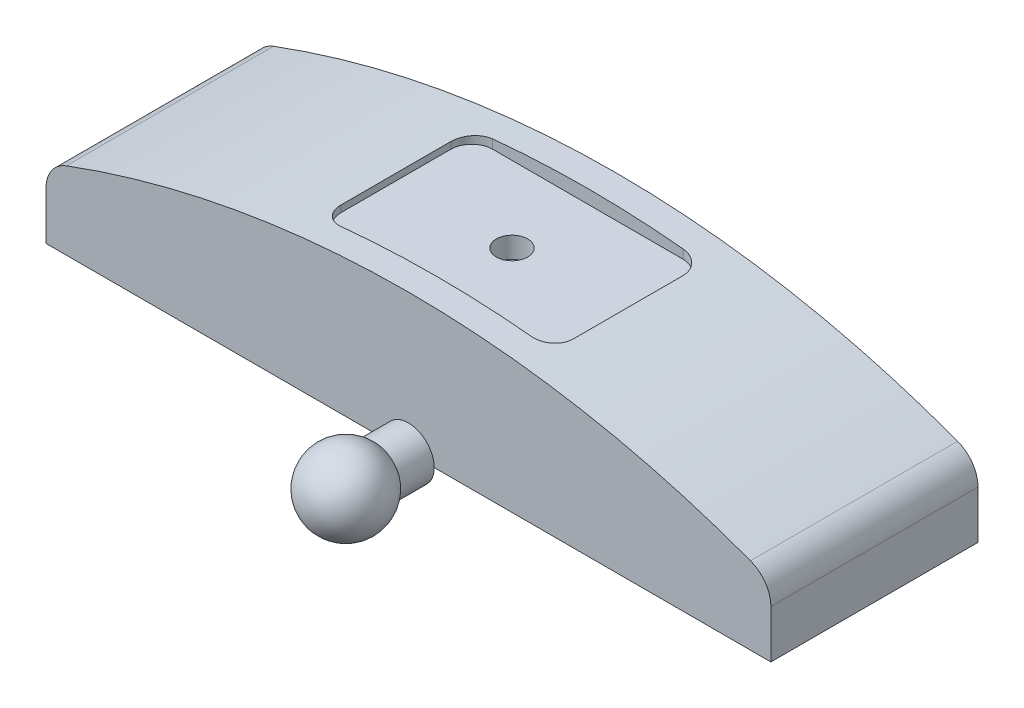
ISO-10303-21;
HEADER;
FILE_DESCRIPTION(('STEP AP214'),'2;1');
FILE_NAME('part.step','',(''),(''),'','','');
FILE_SCHEMA(('AUTOMOTIVE_DESIGN { 1 0 10303 214 1 1 1 1 }'));
ENDSEC;
DATA;
#1=APPLICATION_CONTEXT('core data for automotive mechanical design processes');
#2=APPLICATION_PROTOCOL_DEFINITION('international standard','automotive_design',2000,#1);
#3=PRODUCT_CONTEXT('',#1,'mechanical');
#4=PRODUCT('Part','Part','',(#3));
#5=PRODUCT_RELATED_PRODUCT_CATEGORY('part','',(#4));
#6=PRODUCT_DEFINITION_FORMATION('','',#4);
#7=PRODUCT_DEFINITION_CONTEXT('part definition',#1,'design');
#8=PRODUCT_DEFINITION('design','',#6,#7);
#9=PRODUCT_DEFINITION_SHAPE('','',#8);
#10=(LENGTH_UNIT() NAMED_UNIT(*) SI_UNIT(.MILLI.,.METRE.));
#11=(NAMED_UNIT(*) PLANE_ANGLE_UNIT() SI_UNIT($,.RADIAN.));
#12=(NAMED_UNIT(*) SI_UNIT($,.STERADIAN.) SOLID_ANGLE_UNIT());
#13=UNCERTAINTY_MEASURE_WITH_UNIT(LENGTH_MEASURE(1.E-05),#10,'distance_accuracy_value','');
#14=(GEOMETRIC_REPRESENTATION_CONTEXT(3) GLOBAL_UNCERTAINTY_ASSIGNED_CONTEXT((#13)) GLOBAL_UNIT_ASSIGNED_CONTEXT((#10,
#11,#12)) REPRESENTATION_CONTEXT('',''));
#15=CARTESIAN_POINT('',(0.,0.,0.));
#16=DIRECTION('',(0.,0.,1.));
#17=DIRECTION('',(1.,0.,0.));
#18=AXIS2_PLACEMENT_3D('',#15,#16,#17);
#19=CARTESIAN_POINT('',(-34.65,13.3,-9.9));
#20=DIRECTION('',(0.,0.,1.));
#21=DIRECTION('',(1.,0.,0.));
#22=AXIS2_PLACEMENT_3D('',#19,#20,#21);
#23=PLANE('',#22);
#24=CARTESIAN_POINT('',(0.,-80.2973684210529,-9.9));
#25=DIRECTION('',(0.,0.,-1.));
#26=DIRECTION('',(-1.,0.,0.));
#27=AXIS2_PLACEMENT_3D('',#24,#25,#26);
#28=CIRCLE('',#27,93.5973684210529);
#29=CARTESIAN_POINT('',(32.6980436866413,7.40271889026514,-9.9));
#30=VERTEX_POINT('',#29);
#31=CARTESIAN_POINT('',(-32.6980436866413,7.40271889026514,-9.9));
#32=VERTEX_POINT('',#31);
#33=EDGE_CURVE('E208',#30,#32,#28,.F.);
#34=ORIENTED_EDGE('',*,*,#33,.F.);
#35=CARTESIAN_POINT('',(31.65,4.59173962479709,-9.9));
#36=DIRECTION('',(0.,0.,1.));
#37=DIRECTION('',(1.,0.,0.));
#38=AXIS2_PLACEMENT_3D('',#35,#36,#37);
#39=CIRCLE('',#38,3.);
#40=CARTESIAN_POINT('',(34.65,4.59173962479709,-9.9));
#41=VERTEX_POINT('',#40);
#42=EDGE_CURVE('E301',#30,#41,#39,.F.);
#43=ORIENTED_EDGE('',*,*,#42,.T.);
#44=DIRECTION('',(0.,-1.,0.));
#45=VECTOR('',#44,1.);
#46=CARTESIAN_POINT('',(34.65,13.3,-9.9));
#47=LINE('',#46,#45);
#48=CARTESIAN_POINT('',(34.65,0.,-9.9));
#49=VERTEX_POINT('',#48);
#50=EDGE_CURVE('E256',#41,#49,#47,.T.);
#51=ORIENTED_EDGE('',*,*,#50,.T.);
#52=DIRECTION('',(-1.,0.,0.));
#53=VECTOR('',#52,1.);
#54=CARTESIAN_POINT('',(-34.65,0.,-9.9));
#55=LINE('',#54,#53);
#56=CARTESIAN_POINT('',(-34.65,0.,-9.9));
#57=VERTEX_POINT('',#56);
#58=EDGE_CURVE('E239',#49,#57,#55,.T.);
#59=ORIENTED_EDGE('',*,*,#58,.T.);
#60=DIRECTION('',(0.,-1.,0.));
#61=VECTOR('',#60,1.);
#62=CARTESIAN_POINT('',(-34.65,13.3,-9.9));
#63=LINE('',#62,#61);
#64=CARTESIAN_POINT('',(-34.65,4.59173962479709,-9.9));
#65=VERTEX_POINT('',#64);
#66=EDGE_CURVE('E254',#65,#57,#63,.T.);
#67=ORIENTED_EDGE('',*,*,#66,.F.);
#68=CARTESIAN_POINT('',(-31.65,4.59173962479709,-9.9));
#69=DIRECTION('',(0.,0.,1.));
#70=DIRECTION('',(1.,0.,0.));
#71=AXIS2_PLACEMENT_3D('',#68,#69,#70);
#72=CIRCLE('',#71,3.);
#73=EDGE_CURVE('E299',#65,#32,#72,.F.);
#74=ORIENTED_EDGE('',*,*,#73,.T.);
#75=EDGE_LOOP('',(#34,#43,#51,#59,#67,#74));
#76=FACE_BOUND('',#75,.T.);
#77=ADVANCED_FACE('F51',(#76),#23,.F.);
#78=CARTESIAN_POINT('',(-34.65,13.3,9.9));
#79=DIRECTION('',(0.,0.,-1.));
#80=DIRECTION('',(-1.,0.,0.));
#81=AXIS2_PLACEMENT_3D('',#78,#79,#80);
#82=PLANE('',#81);
#83=DIRECTION('',(0.,-1.,0.));
#84=VECTOR('',#83,1.);
#85=CARTESIAN_POINT('',(34.65,13.3,9.9));
#86=LINE('',#85,#84);
#87=CARTESIAN_POINT('',(34.65,4.59173962479709,9.9));
#88=VERTEX_POINT('',#87);
#89=CARTESIAN_POINT('',(34.65,0.,9.9));
#90=VERTEX_POINT('',#89);
#91=EDGE_CURVE('E249',#88,#90,#86,.T.);
#92=ORIENTED_EDGE('',*,*,#91,.F.);
#93=CARTESIAN_POINT('',(31.65,4.59173962479709,9.9));
#94=DIRECTION('',(0.,0.,-1.));
#95=DIRECTION('',(-1.,0.,0.));
#96=AXIS2_PLACEMENT_3D('',#93,#94,#95);
#97=CIRCLE('',#96,3.);
#98=CARTESIAN_POINT('',(32.6980436866413,7.40271889026514,9.9));
#99=VERTEX_POINT('',#98);
#100=EDGE_CURVE('E59',#88,#99,#97,.F.);
#101=ORIENTED_EDGE('',*,*,#100,.T.);
#102=CARTESIAN_POINT('',(0.,-80.2973684210529,9.9));
#103=DIRECTION('',(0.,0.,-1.));
#104=DIRECTION('',(-1.,0.,0.));
#105=AXIS2_PLACEMENT_3D('',#102,#103,#104);
#106=CIRCLE('',#105,93.5973684210529);
#107=CARTESIAN_POINT('',(-32.6980436866413,7.40271889026514,9.9));
#108=VERTEX_POINT('',#107);
#109=EDGE_CURVE('E227',#99,#108,#106,.F.);
#110=ORIENTED_EDGE('',*,*,#109,.T.);
#111=CARTESIAN_POINT('',(-31.65,4.59173962479709,9.9));
#112=DIRECTION('',(0.,0.,-1.));
#113=DIRECTION('',(-1.,0.,0.));
#114=AXIS2_PLACEMENT_3D('',#111,#112,#113);
#115=CIRCLE('',#114,3.);
#116=CARTESIAN_POINT('',(-34.65,4.59173962479709,9.9));
#117=VERTEX_POINT('',#116);
#118=EDGE_CURVE('E66',#108,#117,#115,.F.);
#119=ORIENTED_EDGE('',*,*,#118,.T.);
#120=DIRECTION('',(0.,-1.,0.));
#121=VECTOR('',#120,1.);
#122=CARTESIAN_POINT('',(-34.65,13.3,9.9));
#123=LINE('',#122,#121);
#124=CARTESIAN_POINT('',(-34.65,0.,9.9));
#125=VERTEX_POINT('',#124);
#126=EDGE_CURVE('E252',#117,#125,#123,.T.);
#127=ORIENTED_EDGE('',*,*,#126,.T.);
#128=DIRECTION('',(1.,0.,0.));
#129=VECTOR('',#128,1.);
#130=CARTESIAN_POINT('',(-34.65,0.,9.9));
#131=LINE('',#130,#129);
#132=CARTESIAN_POINT('',(-2.465,0.,9.9));
#133=VERTEX_POINT('',#132);
#134=EDGE_CURVE('E246',#125,#133,#131,.T.);
#135=ORIENTED_EDGE('',*,*,#134,.T.);
#136=CARTESIAN_POINT('',(0.,0.,9.9));
#137=DIRECTION('',(0.,0.,-1.));
#138=DIRECTION('',(-1.,0.,0.));
#139=AXIS2_PLACEMENT_3D('',#136,#137,#138);
#140=CIRCLE('',#139,2.465);
#141=CARTESIAN_POINT('',(2.465,0.,9.9));
#142=VERTEX_POINT('',#141);
#143=EDGE_CURVE('E230',#133,#142,#140,.T.);
#144=ORIENTED_EDGE('',*,*,#143,.T.);
#145=EDGE_CURVE('E245',#142,#90,#131,.T.);
#146=ORIENTED_EDGE('',*,*,#145,.T.);
#147=EDGE_LOOP('',(#92,#101,#110,#119,#127,#135,#144,#146));
#148=FACE_BOUND('',#147,.T.);
#149=ADVANCED_FACE('F306',(#148),#82,.F.);
#150=CARTESIAN_POINT('',(34.65,13.3,9.9));
#151=DIRECTION('',(-1.,0.,0.));
#152=DIRECTION('',(0.,0.,1.));
#153=AXIS2_PLACEMENT_3D('',#150,#151,#152);
#154=PLANE('',#153);
#155=ORIENTED_EDGE('',*,*,#50,.F.);
#156=DIRECTION('',(0.,0.,-1.));
#157=VECTOR('',#156,1.);
#158=CARTESIAN_POINT('',(34.65,4.59173962479709,9.9));
#159=LINE('',#158,#157);
#160=EDGE_CURVE('E74',#41,#88,#159,.F.);
#161=ORIENTED_EDGE('',*,*,#160,.T.);
#162=ORIENTED_EDGE('',*,*,#91,.T.);
#163=DIRECTION('',(0.,0.,-1.));
#164=VECTOR('',#163,1.);
#165=CARTESIAN_POINT('',(34.65,0.,9.9));
#166=LINE('',#165,#164);
#167=EDGE_CURVE('E236',#90,#49,#166,.T.);
#168=ORIENTED_EDGE('',*,*,#167,.T.);
#169=EDGE_LOOP('',(#155,#161,#162,#168));
#170=FACE_BOUND('',#169,.T.);
#171=ADVANCED_FACE('F316',(#170),#154,.F.);
#172=CARTESIAN_POINT('',(-34.65,13.3,9.9));
#173=DIRECTION('',(1.,0.,0.));
#174=DIRECTION('',(0.,0.,-1.));
#175=AXIS2_PLACEMENT_3D('',#172,#173,#174);
#176=PLANE('',#175);
#177=ORIENTED_EDGE('',*,*,#126,.F.);
#178=DIRECTION('',(0.,0.,-1.));
#179=VECTOR('',#178,1.);
#180=CARTESIAN_POINT('',(-34.65,4.59173962479709,9.9));
#181=LINE('',#180,#179);
#182=EDGE_CURVE('E12',#117,#65,#181,.T.);
#183=ORIENTED_EDGE('',*,*,#182,.T.);
#184=ORIENTED_EDGE('',*,*,#66,.T.);
#185=DIRECTION('',(0.,0.,1.));
#186=VECTOR('',#185,1.);
#187=CARTESIAN_POINT('',(-34.65,0.,9.9));
#188=LINE('',#187,#186);
#189=EDGE_CURVE('E242',#57,#125,#188,.T.);
#190=ORIENTED_EDGE('',*,*,#189,.T.);
#191=EDGE_LOOP('',(#177,#183,#184,#190));
#192=FACE_BOUND('',#191,.T.);
#193=ADVANCED_FACE('F326',(#192),#176,.F.);
#194=CARTESIAN_POINT('',(0.,0.,0.));
#195=DIRECTION('',(0.,-1.,0.));
#196=DIRECTION('',(0.,0.,-1.));
#197=AXIS2_PLACEMENT_3D('',#194,#195,#196);
#198=PLANE('',#197);
#199=ORIENTED_EDGE('',*,*,#167,.F.);
#200=ORIENTED_EDGE('',*,*,#145,.F.);
#201=EDGE_CURVE('E250',#133,#142,#131,.T.);
#202=ORIENTED_EDGE('',*,*,#201,.F.);
#203=ORIENTED_EDGE('',*,*,#134,.F.);
#204=ORIENTED_EDGE('',*,*,#189,.F.);
#205=ORIENTED_EDGE('',*,*,#58,.F.);
#206=EDGE_LOOP('',(#199,#200,#202,#203,#204,#205));
#207=FACE_BOUND('',#206,.T.);
#208=ADVANCED_FACE('F320',(#207),#198,.T.);
#209=CARTESIAN_POINT('',(2.465,0.,9.9));
#210=DIRECTION('',(0.,0.,1.));
#211=DIRECTION('',(1.,0.,0.));
#212=AXIS2_PLACEMENT_3D('',#209,#210,#211);
#213=PLANE('',#212);
#214=EDGE_CURVE('E229',#142,#133,#140,.T.);
#215=ORIENTED_EDGE('',*,*,#214,.T.);
#216=ORIENTED_EDGE('',*,*,#201,.T.);
#217=EDGE_LOOP('',(#215,#216));
#218=FACE_BOUND('',#217,.T.);
#219=ADVANCED_FACE('F349',(#218),#213,.F.);
#220=CARTESIAN_POINT('',(0.,0.,15.8927017510003));
#221=DIRECTION('',(0.,0.,-1.));
#222=DIRECTION('',(1.,0.,0.));
#223=AXIS2_PLACEMENT_3D('',#220,#221,#222);
#224=SPHERICAL_SURFACE('',#223,3.71);
#225=CARTESIAN_POINT('',(0.,0.,13.12));
#226=DIRECTION('',(0.,0.,-1.));
#227=DIRECTION('',(-1.,0.,0.));
#228=AXIS2_PLACEMENT_3D('',#225,#226,#227);
#229=CIRCLE('',#228,2.465);
#230=CARTESIAN_POINT('',(-2.465,0.,13.12));
#231=VERTEX_POINT('',#230);
#232=EDGE_CURVE('E233',#231,#231,#229,.T.);
#233=ORIENTED_EDGE('',*,*,#232,.F.);
#234=EDGE_LOOP('',(#233));
#235=FACE_BOUND('',#234,.T.);
#236=ADVANCED_FACE('F354',(#235),#224,.T.);
#237=CARTESIAN_POINT('',(0.,0.,0.));
#238=DIRECTION('',(0.,0.,-1.));
#239=DIRECTION('',(-1.,0.,0.));
#240=AXIS2_PLACEMENT_3D('',#237,#238,#239);
#241=CYLINDRICAL_SURFACE('',#240,2.465);
#242=ORIENTED_EDGE('',*,*,#143,.F.);
#243=ORIENTED_EDGE('',*,*,#214,.F.);
#244=EDGE_LOOP('',(#242,#243));
#245=FACE_BOUND('',#244,.T.);
#246=ORIENTED_EDGE('',*,*,#232,.T.);
#247=EDGE_LOOP('',(#246));
#248=FACE_BOUND('',#247,.T.);
#249=ADVANCED_FACE('F359',(#245,#248),#241,.T.);
#250=CARTESIAN_POINT('',(0.,-80.2973684210529,19.6027017510003));
#251=DIRECTION('',(0.,0.,-1.));
#252=DIRECTION('',(-1.,0.,0.));
#253=AXIS2_PLACEMENT_3D('',#250,#251,#252);
#254=CYLINDRICAL_SURFACE('',#253,93.5973684210529);
#255=CARTESIAN_POINT('',(0.,-80.2973684210529,-7.25));
#256=DIRECTION('',(0.,0.,-1.));
#257=DIRECTION('',(-1.,0.,0.));
#258=AXIS2_PLACEMENT_3D('',#255,#256,#257);
#259=CIRCLE('',#258,93.5973684210529);
#260=CARTESIAN_POINT('',(-9.09999999999998,12.8565760759265,-7.25));
#261=VERTEX_POINT('',#260);
#262=CARTESIAN_POINT('',(9.09999999999999,12.8565760759265,-7.25));
#263=VERTEX_POINT('',#262);
#264=EDGE_CURVE('E258',#261,#263,#259,.T.);
#265=ORIENTED_EDGE('',*,*,#264,.T.);
#266=CARTESIAN_POINT('',(9.09999999999999,12.8565760759265,-7.25));
#267=CARTESIAN_POINT('',(9.15653455023131,12.8510536330628,-7.24999948761094));
#268=CARTESIAN_POINT('',(9.21303678800726,12.8454817425652,-7.24760140821842));
#269=CARTESIAN_POINT('',(9.32562715926016,12.8342762889866,-7.23803614812002));
#270=CARTESIAN_POINT('',(9.38171531248921,12.8286427288797,-7.23086919639805));
#271=CARTESIAN_POINT('',(9.54866974666014,12.8117220901304,-7.20228333344782));
#272=CARTESIAN_POINT('',(9.65840359692658,12.8003976855252,-7.17377922915236));
#273=CARTESIAN_POINT('',(9.87151656218214,12.7780421654695,-7.09866194207774));
#274=CARTESIAN_POINT('',(9.97489259188444,12.767011193865,-7.05204004627139));
#275=CARTESIAN_POINT('',(10.1723475524341,12.7456355252988,-6.94199141093495));
#276=CARTESIAN_POINT('',(10.2664282640409,12.7352906970139,-6.87856789879459));
#277=CARTESIAN_POINT('',(10.4424864865457,12.7156935920161,-6.73677265819884));
#278=CARTESIAN_POINT('',(10.5244790060956,12.7064399633821,-6.65841974803957));
#279=CARTESIAN_POINT('',(10.6741460419677,12.68938155021,-6.48888979566538));
#280=CARTESIAN_POINT('',(10.7418179913001,12.6815770254572,-6.39771045915694));
#281=CARTESIAN_POINT('',(10.8605323513303,12.667785154184,-6.20562318201792));
#282=CARTESIAN_POINT('',(10.9116562286376,12.6617889157175,-6.10476617103821));
#283=CARTESIAN_POINT('',(10.9962032567277,12.6518258414829,-5.89582639910637));
#284=CARTESIAN_POINT('',(11.0296384602603,12.6478576239202,-5.78774861496166));
#285=CARTESIAN_POINT('',(11.0691134116934,12.6431627821403,-5.60745214697946));
#286=CARTESIAN_POINT('',(11.0806887140456,12.6417827258387,-5.53641385023785));
#287=CARTESIAN_POINT('',(11.0961307551488,12.6399398883787,-5.39359417755277));
#288=CARTESIAN_POINT('',(11.1000083362938,12.6394758170425,-5.32181399013144));
#289=CARTESIAN_POINT('',(11.1,12.6394777452891,-5.24999999999999));
#290=B_SPLINE_CURVE_WITH_KNOTS('',3,(#266,#267,#268,#269,#270,#271,#272,#273,#274,#275,#276,
#277,#278,#279,#280,#281,#282,#283,#284,#285,#286,#287,#288,#289),.UNSPECIFIED.,.F.,.F.,(4,2,2,
2,2,2,2,2,2,2,2,4),(0.,0.170306027196622,0.340603877506613,0.680671059291494,1.02090198557498,
1.36106760489211,1.70080725325535,2.04060774911641,2.37870901426496,2.71657960550479,
2.93215350793614,3.14742355417456),.UNSPECIFIED.);
#291=CARTESIAN_POINT('',(11.1,12.639477745289,-5.24999999999999));
#292=VERTEX_POINT('',#291);
#293=EDGE_CURVE('E168',#263,#292,#290,.T.);
#294=ORIENTED_EDGE('',*,*,#293,.T.);
#295=DIRECTION('',(0.,0.,-1.));
#296=VECTOR('',#295,1.);
#297=CARTESIAN_POINT('',(11.1,12.639477745289,19.6027017510003));
#298=LINE('',#297,#296);
#299=CARTESIAN_POINT('',(11.1,12.639477745289,5.24999999999999));
#300=VERTEX_POINT('',#299);
#301=EDGE_CURVE('E293',#292,#300,#298,.F.);
#302=ORIENTED_EDGE('',*,*,#301,.T.);
#303=CARTESIAN_POINT('',(11.1,12.639477745289,5.24999999999999));
#304=CARTESIAN_POINT('',(11.0999998426773,12.6394774709147,5.30599628355265));
#305=CARTESIAN_POINT('',(11.0976468211732,12.6397588321076,5.36196562292542));
#306=CARTESIAN_POINT('',(11.0882611027799,12.6408792170863,5.47350124783135));
#307=CARTESIAN_POINT('',(11.0812287069477,12.6417182049961,5.52906755906165));
#308=CARTESIAN_POINT('',(11.0531860193531,12.6450590888856,5.69444303246902));
#309=CARTESIAN_POINT('',(11.025230001089,12.6483849495873,5.80314036321473));
#310=CARTESIAN_POINT('',(10.9516028018369,12.6570888626359,6.01425631018584));
#311=CARTESIAN_POINT('',(10.9059245308835,12.6624677362973,6.11667239452128));
#312=CARTESIAN_POINT('',(10.7981877767267,12.675043863277,6.3123680242856));
#313=CARTESIAN_POINT('',(10.7361311041927,12.6822409155878,6.40564857810617));
#314=CARTESIAN_POINT('',(10.5971840484717,12.698179631509,6.58078185966248));
#315=CARTESIAN_POINT('',(10.5202437107798,12.7069264882234,6.66259445584513));
#316=CARTESIAN_POINT('',(10.3538415110802,12.7255982942276,6.81217750617866));
#317=CARTESIAN_POINT('',(10.2643769750164,12.7355234950381,6.87994495384881));
#318=CARTESIAN_POINT('',(10.0748460994836,12.7562397276893,6.99995522765812));
#319=CARTESIAN_POINT('',(9.97471397147699,12.7670360193401,7.05209313809807));
#320=CARTESIAN_POINT('',(9.76717544662082,12.7890458411585,7.13878440485414));
#321=CARTESIAN_POINT('',(9.65977290494422,12.8002591488018,7.17334699907894));
#322=CARTESIAN_POINT('',(9.47648214225205,12.8190596538466,7.21570890834985));
#323=CARTESIAN_POINT('',(9.40172048878523,12.8266386044575,7.22855832640662));
#324=CARTESIAN_POINT('',(9.25131923726787,12.8417009003222,7.2457032395715));
#325=CARTESIAN_POINT('',(9.17568099477044,12.8491843631893,7.25001052729763));
#326=CARTESIAN_POINT('',(9.09999999999999,12.8565760759264,7.25));
#327=B_SPLINE_CURVE_WITH_KNOTS('',3,(#303,#304,#305,#306,#307,#308,#309,#310,#311,#312,#313,
#314,#315,#316,#317,#318,#319,#320,#321,#322,#323,#324,#325,#326),.UNSPECIFIED.,.F.,.F.,(4,2,2,
2,2,2,2,2,2,2,2,4),(0.,0.167885269410749,0.335759738628335,0.670881901590965,1.00613827201593,
1.34135759460158,1.6777221820723,2.01415869698149,2.35280547191413,2.6912740634207,
2.91952573291608,3.14746207548646),.UNSPECIFIED.);
#328=CARTESIAN_POINT('',(9.09999999999999,12.8565760759265,7.25));
#329=VERTEX_POINT('',#328);
#330=EDGE_CURVE('E390',#300,#329,#327,.T.);
#331=ORIENTED_EDGE('',*,*,#330,.T.);
#332=CARTESIAN_POINT('',(0.,-80.2973684210529,7.25));
#333=DIRECTION('',(0.,0.,1.));
#334=DIRECTION('',(1.,0.,0.));
#335=AXIS2_PLACEMENT_3D('',#332,#333,#334);
#336=CIRCLE('',#335,93.5973684210529);
#337=CARTESIAN_POINT('',(-9.09999999999998,12.8565760759265,7.25));
#338=VERTEX_POINT('',#337);
#339=EDGE_CURVE('E391',#329,#338,#336,.T.);
#340=ORIENTED_EDGE('',*,*,#339,.T.);
#341=CARTESIAN_POINT('',(-9.09999999999998,12.8565760759265,7.25));
#342=CARTESIAN_POINT('',(-9.15653455023131,12.8510536330628,7.24999948761094));
#343=CARTESIAN_POINT('',(-9.21303678800726,12.8454817425652,7.24760140821843));
#344=CARTESIAN_POINT('',(-9.32562715926016,12.8342762889866,7.23803614812002));
#345=CARTESIAN_POINT('',(-9.38171531248921,12.8286427288797,7.23086919639805));
#346=CARTESIAN_POINT('',(-9.54866974666014,12.8117220901304,7.20228333344782));
#347=CARTESIAN_POINT('',(-9.65840359692657,12.8003976855252,7.17377922915236));
#348=CARTESIAN_POINT('',(-9.87151656218214,12.7780421654695,7.09866194207774));
#349=CARTESIAN_POINT('',(-9.97489259188443,12.767011193865,7.0520400462714));
#350=CARTESIAN_POINT('',(-10.1723475524341,12.7456355252988,6.94199141093496));
#351=CARTESIAN_POINT('',(-10.2664282640409,12.7352906970139,6.87856789879459));
#352=CARTESIAN_POINT('',(-10.4424864865456,12.7156935920161,6.73677265819884));
#353=CARTESIAN_POINT('',(-10.5244790060956,12.7064399633821,6.65841974803957));
#354=CARTESIAN_POINT('',(-10.6741460419677,12.68938155021,6.48888979566538));
#355=CARTESIAN_POINT('',(-10.7418179913001,12.6815770254572,6.39771045915694));
#356=CARTESIAN_POINT('',(-10.8605323513303,12.667785154184,6.20562318201792));
#357=CARTESIAN_POINT('',(-10.9116562286375,12.6617889157175,6.10476617103821));
#358=CARTESIAN_POINT('',(-10.9962032567277,12.6518258414829,5.89582639910637));
#359=CARTESIAN_POINT('',(-11.0296384602602,12.6478576239202,5.78774861496166));
#360=CARTESIAN_POINT('',(-11.0691134116934,12.6431627821403,5.60745214697947));
#361=CARTESIAN_POINT('',(-11.0806887140455,12.6417827258387,5.53641385023786));
#362=CARTESIAN_POINT('',(-11.0961307551488,12.6399398883787,5.39359417755278));
#363=CARTESIAN_POINT('',(-11.1000083362938,12.6394758170425,5.32181399013144));
#364=CARTESIAN_POINT('',(-11.1,12.6394777452891,5.24999999999999));
#365=B_SPLINE_CURVE_WITH_KNOTS('',3,(#341,#342,#343,#344,#345,#346,#347,#348,#349,#350,#351,
#352,#353,#354,#355,#356,#357,#358,#359,#360,#361,#362,#363,#364),.UNSPECIFIED.,.F.,.F.,(4,2,2,
2,2,2,2,2,2,2,2,4),(0.,0.170306027196622,0.340603877506617,0.680671059291495,1.02090198557498,
1.36106760489211,1.70080725325535,2.04060774911641,2.37870901426496,2.71657960550479,
2.93215350793614,3.14742355417456),.UNSPECIFIED.);
#366=CARTESIAN_POINT('',(-11.1,12.639477745289,5.24999999999999));
#367=VERTEX_POINT('',#366);
#368=EDGE_CURVE('E382',#338,#367,#365,.T.);
#369=ORIENTED_EDGE('',*,*,#368,.T.);
#370=DIRECTION('',(0.,0.,-1.));
#371=VECTOR('',#370,1.);
#372=CARTESIAN_POINT('',(-11.1,12.639477745289,19.6027017510003));
#373=LINE('',#372,#371);
#374=CARTESIAN_POINT('',(-11.1,12.639477745289,-5.24999999999998));
#375=VERTEX_POINT('',#374);
#376=EDGE_CURVE('E268',#367,#375,#373,.T.);
#377=ORIENTED_EDGE('',*,*,#376,.T.);
#378=CARTESIAN_POINT('',(-11.1,12.639477745289,-5.24999999999999));
#379=CARTESIAN_POINT('',(-11.0999998426773,12.6394774709147,-5.30599628355264));
#380=CARTESIAN_POINT('',(-11.0976468211732,12.6397588321076,-5.36196562292542));
#381=CARTESIAN_POINT('',(-11.0882611027799,12.6408792170863,-5.47350124783134));
#382=CARTESIAN_POINT('',(-11.0812287069477,12.6417182049961,-5.52906755906164));
#383=CARTESIAN_POINT('',(-11.0531860193531,12.6450590888856,-5.69444303246902));
#384=CARTESIAN_POINT('',(-11.025230001089,12.6483849495873,-5.80314036321473));
#385=CARTESIAN_POINT('',(-10.9516028018369,12.6570888626359,-6.01425631018584));
#386=CARTESIAN_POINT('',(-10.9059245308835,12.6624677362974,-6.11667239452127));
#387=CARTESIAN_POINT('',(-10.7981877767267,12.6750438632771,-6.3123680242856));
#388=CARTESIAN_POINT('',(-10.7361311041927,12.6822409155878,-6.40564857810617));
#389=CARTESIAN_POINT('',(-10.5971840484717,12.698179631509,-6.58078185966247));
#390=CARTESIAN_POINT('',(-10.5202437107798,12.7069264882234,-6.66259445584512));
#391=CARTESIAN_POINT('',(-10.3538415110802,12.7255982942276,-6.81217750617865));
#392=CARTESIAN_POINT('',(-10.2643769750164,12.7355234950381,-6.87994495384881));
#393=CARTESIAN_POINT('',(-10.0748460994836,12.7562397276893,-6.99995522765811));
#394=CARTESIAN_POINT('',(-9.97471397147699,12.7670360193401,-7.05209313809807));
#395=CARTESIAN_POINT('',(-9.76717544662081,12.7890458411586,-7.13878440485414));
#396=CARTESIAN_POINT('',(-9.65977290494422,12.8002591488018,-7.17334699907894));
#397=CARTESIAN_POINT('',(-9.47648214225204,12.8190596538466,-7.21570890834984));
#398=CARTESIAN_POINT('',(-9.40172048878522,12.8266386044575,-7.22855832640662));
#399=CARTESIAN_POINT('',(-9.25131923726786,12.8417009003222,-7.2457032395715));
#400=CARTESIAN_POINT('',(-9.17568099477043,12.8491843631893,-7.25001052729763));
#401=CARTESIAN_POINT('',(-9.09999999999998,12.8565760759264,-7.25));
#402=B_SPLINE_CURVE_WITH_KNOTS('',3,(#378,#379,#380,#381,#382,#383,#384,#385,#386,#387,#388,
#389,#390,#391,#392,#393,#394,#395,#396,#397,#398,#399,#400,#401),.UNSPECIFIED.,.F.,.F.,(4,2,2,
2,2,2,2,2,2,2,2,4),(0.,0.16788526941075,0.335759738628336,0.670881901590966,1.00613827201593,
1.34135759460158,1.6777221820723,2.01415869698149,2.35280547191413,2.6912740634207,
2.91952573291608,3.14746207548646),.UNSPECIFIED.);
#403=EDGE_CURVE('E260',#375,#261,#402,.T.);
#404=ORIENTED_EDGE('',*,*,#403,.T.);
#405=EDGE_LOOP('',(#265,#294,#302,#331,#340,#369,#377,#404));
#406=FACE_BOUND('',#405,.T.);
#407=ORIENTED_EDGE('',*,*,#109,.F.);
#408=DIRECTION('',(0.,0.,-1.));
#409=VECTOR('',#408,1.);
#410=CARTESIAN_POINT('',(32.6980436866413,7.40271889026514,19.6027017510003));
#411=LINE('',#410,#409);
#412=EDGE_CURVE('E296',#99,#30,#411,.T.);
#413=ORIENTED_EDGE('',*,*,#412,.T.);
#414=ORIENTED_EDGE('',*,*,#33,.T.);
#415=DIRECTION('',(0.,0.,-1.));
#416=VECTOR('',#415,1.);
#417=CARTESIAN_POINT('',(-32.6980436866413,7.40271889026514,19.6027017510003));
#418=LINE('',#417,#416);
#419=EDGE_CURVE('E292',#32,#108,#418,.F.);
#420=ORIENTED_EDGE('',*,*,#419,.T.);
#421=EDGE_LOOP('',(#407,#413,#414,#420));
#422=FACE_BOUND('',#421,.T.);
#423=ADVANCED_FACE('F270',(#406,#422),#254,.T.);
#424=CARTESIAN_POINT('',(9.1,12.,-5.25));
#425=DIRECTION('',(0.,1.,0.));
#426=DIRECTION('',(0.,0.,1.));
#427=AXIS2_PLACEMENT_3D('',#424,#425,#426);
#428=CYLINDRICAL_SURFACE('',#427,2.);
#429=DIRECTION('',(0.,1.,0.));
#430=VECTOR('',#429,1.);
#431=CARTESIAN_POINT('',(9.09999999999999,12.,-7.25));
#432=LINE('',#431,#430);
#433=CARTESIAN_POINT('',(9.09999999999999,12.,-7.25));
#434=VERTEX_POINT('',#433);
#435=EDGE_CURVE('E160',#434,#263,#432,.T.);
#436=ORIENTED_EDGE('',*,*,#435,.F.);
#437=CARTESIAN_POINT('',(9.1,12.,-5.25));
#438=DIRECTION('',(0.,1.,0.));
#439=DIRECTION('',(0.,0.,-1.));
#440=AXIS2_PLACEMENT_3D('',#437,#438,#439);
#441=CIRCLE('',#440,2.);
#442=CARTESIAN_POINT('',(11.1,12.,-5.24999999999999));
#443=VERTEX_POINT('',#442);
#444=EDGE_CURVE('E165',#443,#434,#441,.T.);
#445=ORIENTED_EDGE('',*,*,#444,.F.);
#446=DIRECTION('',(0.,1.,0.));
#447=VECTOR('',#446,1.);
#448=CARTESIAN_POINT('',(11.1,12.,-5.24999999999999));
#449=LINE('',#448,#447);
#450=EDGE_CURVE('E206',#443,#292,#449,.T.);
#451=ORIENTED_EDGE('',*,*,#450,.T.);
#452=ORIENTED_EDGE('',*,*,#293,.F.);
#453=EDGE_LOOP('',(#436,#445,#451,#452));
#454=FACE_BOUND('',#453,.T.);
#455=ADVANCED_FACE('F162',(#454),#428,.F.);
#456=CARTESIAN_POINT('',(11.1,12.,5.24999999999999));
#457=DIRECTION('',(1.,0.,0.));
#458=DIRECTION('',(0.,0.,-1.));
#459=AXIS2_PLACEMENT_3D('',#456,#457,#458);
#460=PLANE('',#459);
#461=ORIENTED_EDGE('',*,*,#450,.F.);
#462=DIRECTION('',(0.,0.,-1.));
#463=VECTOR('',#462,1.);
#464=CARTESIAN_POINT('',(11.1,12.,5.24999999999999));
#465=LINE('',#464,#463);
#466=CARTESIAN_POINT('',(11.1,12.,5.24999999999999));
#467=VERTEX_POINT('',#466);
#468=EDGE_CURVE('E172',#467,#443,#465,.T.);
#469=ORIENTED_EDGE('',*,*,#468,.F.);
#470=DIRECTION('',(0.,1.,0.));
#471=VECTOR('',#470,1.);
#472=CARTESIAN_POINT('',(11.1,12.,5.24999999999999));
#473=LINE('',#472,#471);
#474=EDGE_CURVE('E209',#467,#300,#473,.T.);
#475=ORIENTED_EDGE('',*,*,#474,.T.);
#476=ORIENTED_EDGE('',*,*,#301,.F.);
#477=EDGE_LOOP('',(#461,#469,#475,#476));
#478=FACE_BOUND('',#477,.T.);
#479=ADVANCED_FACE('F285',(#478),#460,.F.);
#480=CARTESIAN_POINT('',(9.1,12.,5.25));
#481=DIRECTION('',(0.,1.,0.));
#482=DIRECTION('',(0.,0.,1.));
#483=AXIS2_PLACEMENT_3D('',#480,#481,#482);
#484=CYLINDRICAL_SURFACE('',#483,2.);
#485=ORIENTED_EDGE('',*,*,#474,.F.);
#486=CARTESIAN_POINT('',(9.1,12.,5.25));
#487=DIRECTION('',(0.,1.,0.));
#488=DIRECTION('',(0.,0.,1.));
#489=AXIS2_PLACEMENT_3D('',#486,#487,#488);
#490=CIRCLE('',#489,2.);
#491=CARTESIAN_POINT('',(9.09999999999999,12.,7.25));
#492=VERTEX_POINT('',#491);
#493=EDGE_CURVE('E203',#492,#467,#490,.T.);
#494=ORIENTED_EDGE('',*,*,#493,.F.);
#495=DIRECTION('',(0.,1.,0.));
#496=VECTOR('',#495,1.);
#497=CARTESIAN_POINT('',(9.09999999999999,12.,7.25));
#498=LINE('',#497,#496);
#499=EDGE_CURVE('E212',#492,#329,#498,.T.);
#500=ORIENTED_EDGE('',*,*,#499,.T.);
#501=ORIENTED_EDGE('',*,*,#330,.F.);
#502=EDGE_LOOP('',(#485,#494,#500,#501));
#503=FACE_BOUND('',#502,.T.);
#504=ADVANCED_FACE('F397',(#503),#484,.F.);
#505=CARTESIAN_POINT('',(-9.09999999999998,12.,7.25));
#506=DIRECTION('',(0.,0.,1.));
#507=DIRECTION('',(1.,0.,0.));
#508=AXIS2_PLACEMENT_3D('',#505,#506,#507);
#509=PLANE('',#508);
#510=ORIENTED_EDGE('',*,*,#499,.F.);
#511=DIRECTION('',(1.,0.,0.));
#512=VECTOR('',#511,1.);
#513=CARTESIAN_POINT('',(-9.09999999999998,12.,7.25));
#514=LINE('',#513,#512);
#515=CARTESIAN_POINT('',(-9.09999999999998,12.,7.25));
#516=VERTEX_POINT('',#515);
#517=EDGE_CURVE('E200',#516,#492,#514,.T.);
#518=ORIENTED_EDGE('',*,*,#517,.F.);
#519=DIRECTION('',(0.,1.,0.));
#520=VECTOR('',#519,1.);
#521=CARTESIAN_POINT('',(-9.09999999999998,12.,7.25));
#522=LINE('',#521,#520);
#523=EDGE_CURVE('E215',#516,#338,#522,.T.);
#524=ORIENTED_EDGE('',*,*,#523,.T.);
#525=ORIENTED_EDGE('',*,*,#339,.F.);
#526=EDGE_LOOP('',(#510,#518,#524,#525));
#527=FACE_BOUND('',#526,.T.);
#528=ADVANCED_FACE('F385',(#527),#509,.F.);
#529=CARTESIAN_POINT('',(-9.1,12.,5.25));
#530=DIRECTION('',(0.,1.,0.));
#531=DIRECTION('',(0.,0.,1.));
#532=AXIS2_PLACEMENT_3D('',#529,#530,#531);
#533=CYLINDRICAL_SURFACE('',#532,2.);
#534=ORIENTED_EDGE('',*,*,#523,.F.);
#535=CARTESIAN_POINT('',(-9.1,12.,5.25));
#536=DIRECTION('',(0.,1.,0.));
#537=DIRECTION('',(0.,0.,-1.));
#538=AXIS2_PLACEMENT_3D('',#535,#536,#537);
#539=CIRCLE('',#538,2.);
#540=CARTESIAN_POINT('',(-11.1,12.,5.24999999999999));
#541=VERTEX_POINT('',#540);
#542=EDGE_CURVE('E197',#541,#516,#539,.T.);
#543=ORIENTED_EDGE('',*,*,#542,.F.);
#544=DIRECTION('',(0.,1.,0.));
#545=VECTOR('',#544,1.);
#546=CARTESIAN_POINT('',(-11.1,12.,5.24999999999999));
#547=LINE('',#546,#545);
#548=EDGE_CURVE('E218',#541,#367,#547,.T.);
#549=ORIENTED_EDGE('',*,*,#548,.T.);
#550=ORIENTED_EDGE('',*,*,#368,.F.);
#551=EDGE_LOOP('',(#534,#543,#549,#550));
#552=FACE_BOUND('',#551,.T.);
#553=ADVANCED_FACE('F380',(#552),#533,.F.);
#554=CARTESIAN_POINT('',(-11.1,12.,5.24999999999999));
#555=DIRECTION('',(-1.,0.,0.));
#556=DIRECTION('',(0.,0.,1.));
#557=AXIS2_PLACEMENT_3D('',#554,#555,#556);
#558=PLANE('',#557);
#559=ORIENTED_EDGE('',*,*,#548,.F.);
#560=DIRECTION('',(0.,0.,1.));
#561=VECTOR('',#560,1.);
#562=CARTESIAN_POINT('',(-11.1,12.,5.24999999999999));
#563=LINE('',#562,#561);
#564=CARTESIAN_POINT('',(-11.1,12.,-5.24999999999998));
#565=VERTEX_POINT('',#564);
#566=EDGE_CURVE('E194',#565,#541,#563,.T.);
#567=ORIENTED_EDGE('',*,*,#566,.F.);
#568=DIRECTION('',(0.,1.,0.));
#569=VECTOR('',#568,1.);
#570=CARTESIAN_POINT('',(-11.1,12.,-5.24999999999998));
#571=LINE('',#570,#569);
#572=EDGE_CURVE('E221',#565,#375,#571,.T.);
#573=ORIENTED_EDGE('',*,*,#572,.T.);
#574=ORIENTED_EDGE('',*,*,#376,.F.);
#575=EDGE_LOOP('',(#559,#567,#573,#574));
#576=FACE_BOUND('',#575,.T.);
#577=ADVANCED_FACE('F279',(#576),#558,.F.);
#578=CARTESIAN_POINT('',(-9.1,12.,-5.25));
#579=DIRECTION('',(0.,1.,0.));
#580=DIRECTION('',(0.,0.,1.));
#581=AXIS2_PLACEMENT_3D('',#578,#579,#580);
#582=CYLINDRICAL_SURFACE('',#581,2.);
#583=ORIENTED_EDGE('',*,*,#572,.F.);
#584=CARTESIAN_POINT('',(-9.1,12.,-5.25));
#585=DIRECTION('',(0.,1.,0.));
#586=DIRECTION('',(0.,0.,-1.));
#587=AXIS2_PLACEMENT_3D('',#584,#585,#586);
#588=CIRCLE('',#587,2.);
#589=CARTESIAN_POINT('',(-9.09999999999998,12.,-7.25));
#590=VERTEX_POINT('',#589);
#591=EDGE_CURVE('E181',#590,#565,#588,.T.);
#592=ORIENTED_EDGE('',*,*,#591,.F.);
#593=DIRECTION('',(0.,1.,0.));
#594=VECTOR('',#593,1.);
#595=CARTESIAN_POINT('',(-9.09999999999998,12.,-7.25));
#596=LINE('',#595,#594);
#597=EDGE_CURVE('E171',#590,#261,#596,.T.);
#598=ORIENTED_EDGE('',*,*,#597,.T.);
#599=ORIENTED_EDGE('',*,*,#403,.F.);
#600=EDGE_LOOP('',(#583,#592,#598,#599));
#601=FACE_BOUND('',#600,.T.);
#602=ADVANCED_FACE('F274',(#601),#582,.F.);
#603=CARTESIAN_POINT('',(-9.09999999999998,12.,-7.25));
#604=DIRECTION('',(0.,0.,-1.));
#605=DIRECTION('',(-1.,0.,0.));
#606=AXIS2_PLACEMENT_3D('',#603,#604,#605);
#607=PLANE('',#606);
#608=ORIENTED_EDGE('',*,*,#597,.F.);
#609=DIRECTION('',(-1.,0.,0.));
#610=VECTOR('',#609,1.);
#611=CARTESIAN_POINT('',(-9.09999999999998,12.,-7.25));
#612=LINE('',#611,#610);
#613=EDGE_CURVE('E175',#434,#590,#612,.T.);
#614=ORIENTED_EDGE('',*,*,#613,.F.);
#615=ORIENTED_EDGE('',*,*,#435,.T.);
#616=ORIENTED_EDGE('',*,*,#264,.F.);
#617=EDGE_LOOP('',(#608,#614,#615,#616));
#618=FACE_BOUND('',#617,.T.);
#619=ADVANCED_FACE('F176',(#618),#607,.F.);
#620=CARTESIAN_POINT('',(9.1,12.,-5.25));
#621=DIRECTION('',(0.,-1.,0.));
#622=DIRECTION('',(0.,0.,-1.));
#623=AXIS2_PLACEMENT_3D('',#620,#621,#622);
#624=PLANE('',#623);
#625=CARTESIAN_POINT('',(0.,12.,0.));
#626=DIRECTION('',(0.,1.,0.));
#627=DIRECTION('',(0.,0.,1.));
#628=AXIS2_PLACEMENT_3D('',#625,#626,#627);
#629=CIRCLE('',#628,1.5);
#630=CARTESIAN_POINT('',(0.,12.,1.5));
#631=VERTEX_POINT('',#630);
#632=EDGE_CURVE('E189',#631,#631,#629,.T.);
#633=ORIENTED_EDGE('',*,*,#632,.F.);
#634=EDGE_LOOP('',(#633));
#635=FACE_BOUND('',#634,.T.);
#636=ORIENTED_EDGE('',*,*,#444,.T.);
#637=ORIENTED_EDGE('',*,*,#613,.T.);
#638=ORIENTED_EDGE('',*,*,#591,.T.);
#639=ORIENTED_EDGE('',*,*,#566,.T.);
#640=ORIENTED_EDGE('',*,*,#542,.T.);
#641=ORIENTED_EDGE('',*,*,#517,.T.);
#642=ORIENTED_EDGE('',*,*,#493,.T.);
#643=ORIENTED_EDGE('',*,*,#468,.T.);
#644=EDGE_LOOP('',(#636,#637,#638,#639,#640,#641,#642,#643));
#645=FACE_BOUND('',#644,.T.);
#646=ADVANCED_FACE('F183',(#635,#645),#624,.F.);
#647=CARTESIAN_POINT('',(0.,10.,0.));
#648=DIRECTION('',(0.,1.,0.));
#649=DIRECTION('',(0.,0.,1.));
#650=AXIS2_PLACEMENT_3D('',#647,#648,#649);
#651=CYLINDRICAL_SURFACE('',#650,1.5);
#652=CARTESIAN_POINT('',(0.,10.,0.));
#653=DIRECTION('',(0.,1.,0.));
#654=DIRECTION('',(0.,0.,1.));
#655=AXIS2_PLACEMENT_3D('',#652,#653,#654);
#656=CIRCLE('',#655,1.5);
#657=CARTESIAN_POINT('',(0.,10.,1.5));
#658=VERTEX_POINT('',#657);
#659=EDGE_CURVE('E186',#658,#658,#656,.T.);
#660=ORIENTED_EDGE('',*,*,#659,.F.);
#661=EDGE_LOOP('',(#660));
#662=FACE_BOUND('',#661,.T.);
#663=ORIENTED_EDGE('',*,*,#632,.T.);
#664=EDGE_LOOP('',(#663));
#665=FACE_BOUND('',#664,.T.);
#666=ADVANCED_FACE('F428',(#662,#665),#651,.F.);
#667=CARTESIAN_POINT('',(0.,10.,0.));
#668=DIRECTION('',(0.,1.,0.));
#669=DIRECTION('',(0.,0.,1.));
#670=AXIS2_PLACEMENT_3D('',#667,#668,#669);
#671=PLANE('',#670);
#672=ORIENTED_EDGE('',*,*,#659,.T.);
#673=EDGE_LOOP('',(#672));
#674=FACE_BOUND('',#673,.T.);
#675=ADVANCED_FACE('F333',(#674),#671,.T.);
#676=CARTESIAN_POINT('',(31.65,4.59173962479709,19.6027017510003));
#677=DIRECTION('',(0.,0.,-1.));
#678=DIRECTION('',(-1.,0.,0.));
#679=AXIS2_PLACEMENT_3D('',#676,#677,#678);
#680=CYLINDRICAL_SURFACE('',#679,3.);
#681=ORIENTED_EDGE('',*,*,#100,.F.);
#682=ORIENTED_EDGE('',*,*,#160,.F.);
#683=ORIENTED_EDGE('',*,*,#42,.F.);
#684=ORIENTED_EDGE('',*,*,#412,.F.);
#685=EDGE_LOOP('',(#681,#682,#683,#684));
#686=FACE_BOUND('',#685,.T.);
#687=ADVANCED_FACE('F313',(#686),#680,.T.);
#688=CARTESIAN_POINT('',(-31.65,4.59173962479709,19.6027017510003));
#689=DIRECTION('',(0.,0.,-1.));
#690=DIRECTION('',(-1.,0.,0.));
#691=AXIS2_PLACEMENT_3D('',#688,#689,#690);
#692=CYLINDRICAL_SURFACE('',#691,3.);
#693=ORIENTED_EDGE('',*,*,#118,.F.);
#694=ORIENTED_EDGE('',*,*,#419,.F.);
#695=ORIENTED_EDGE('',*,*,#73,.F.);
#696=ORIENTED_EDGE('',*,*,#182,.F.);
#697=EDGE_LOOP('',(#693,#694,#695,#696));
#698=FACE_BOUND('',#697,.T.);
#699=ADVANCED_FACE('F53',(#698),#692,.T.);
#700=CLOSED_SHELL('',(#77,#149,#171,#193,#208,#219,#236,#249,#423,#455,#479,#504,#528,#553,#577,
#602,#619,#646,#666,#675,#687,#699));
#701=MANIFOLD_SOLID_BREP('B2',#700);
#702=ADVANCED_BREP_SHAPE_REPRESENTATION('',(#18,#701),#14);
#703=SHAPE_DEFINITION_REPRESENTATION(#9,#702);
ENDSEC;
END-ISO-10303-21;
